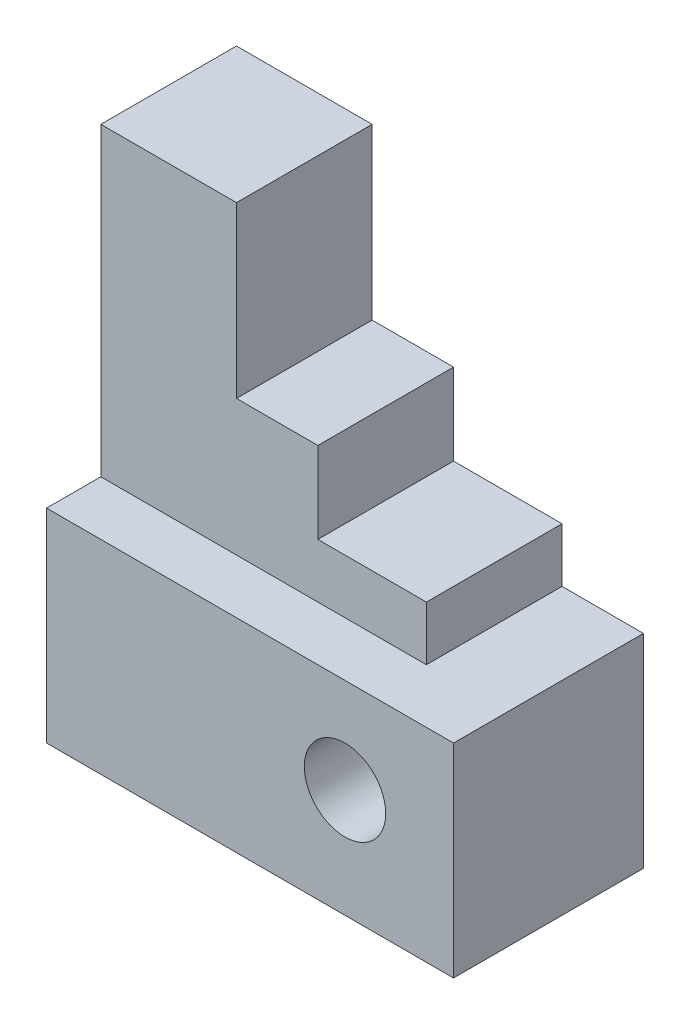
ISO-10303-21;
HEADER;
FILE_DESCRIPTION(('STEP AP214'),'2;1');
FILE_NAME('part.step','',(''),(''),'','','');
FILE_SCHEMA(('AUTOMOTIVE_DESIGN { 1 0 10303 214 1 1 1 1 }'));
ENDSEC;
DATA;
#1=APPLICATION_CONTEXT('core data for automotive mechanical design processes');
#2=APPLICATION_PROTOCOL_DEFINITION('international standard','automotive_design',2000,#1);
#3=PRODUCT_CONTEXT('',#1,'mechanical');
#4=PRODUCT('Part','Part','',(#3));
#5=PRODUCT_RELATED_PRODUCT_CATEGORY('part','',(#4));
#6=PRODUCT_DEFINITION_FORMATION('','',#4);
#7=PRODUCT_DEFINITION_CONTEXT('part definition',#1,'design');
#8=PRODUCT_DEFINITION('design','',#6,#7);
#9=PRODUCT_DEFINITION_SHAPE('','',#8);
#10=(LENGTH_UNIT() NAMED_UNIT(*) SI_UNIT(.MILLI.,.METRE.));
#11=(NAMED_UNIT(*) PLANE_ANGLE_UNIT() SI_UNIT($,.RADIAN.));
#12=(NAMED_UNIT(*) SI_UNIT($,.STERADIAN.) SOLID_ANGLE_UNIT());
#13=UNCERTAINTY_MEASURE_WITH_UNIT(LENGTH_MEASURE(1.E-05),#10,'distance_accuracy_value','');
#14=(GEOMETRIC_REPRESENTATION_CONTEXT(3) GLOBAL_UNCERTAINTY_ASSIGNED_CONTEXT((#13)) GLOBAL_UNIT_ASSIGNED_CONTEXT((#10,
#11,#12)) REPRESENTATION_CONTEXT('',''));
#15=CARTESIAN_POINT('',(0.,0.,0.));
#16=DIRECTION('',(0.,0.,1.));
#17=DIRECTION('',(1.,0.,0.));
#18=AXIS2_PLACEMENT_3D('',#15,#16,#17);
#19=CARTESIAN_POINT('',(0.,30.,28.));
#20=DIRECTION('',(0.,-1.,0.));
#21=DIRECTION('',(0.,0.,-1.));
#22=AXIS2_PLACEMENT_3D('',#19,#20,#21);
#23=PLANE('',#22);
#24=DIRECTION('',(0.,0.,-1.));
#25=VECTOR('',#24,1.);
#26=CARTESIAN_POINT('',(48.,30.,20.));
#27=LINE('',#26,#25);
#28=CARTESIAN_POINT('',(48.,30.,20.));
#29=VERTEX_POINT('',#28);
#30=CARTESIAN_POINT('',(48.,30.,0.));
#31=VERTEX_POINT('',#30);
#32=EDGE_CURVE('E126',#29,#31,#27,.T.);
#33=ORIENTED_EDGE('',*,*,#32,.F.);
#34=DIRECTION('',(1.,0.,0.));
#35=VECTOR('',#34,1.);
#36=CARTESIAN_POINT('',(48.,30.,20.));
#37=LINE('',#36,#35);
#38=CARTESIAN_POINT('',(0.,30.,20.));
#39=VERTEX_POINT('',#38);
#40=EDGE_CURVE('E59',#39,#29,#37,.T.);
#41=ORIENTED_EDGE('',*,*,#40,.F.);
#42=DIRECTION('',(0.,0.,-1.));
#43=VECTOR('',#42,1.);
#44=CARTESIAN_POINT('',(0.,30.,28.));
#45=LINE('',#44,#43);
#46=CARTESIAN_POINT('',(0.,30.,28.));
#47=VERTEX_POINT('',#46);
#48=EDGE_CURVE('E227',#47,#39,#45,.T.);
#49=ORIENTED_EDGE('',*,*,#48,.F.);
#50=DIRECTION('',(-1.,0.,0.));
#51=VECTOR('',#50,1.);
#52=CARTESIAN_POINT('',(0.,30.,28.));
#53=LINE('',#52,#51);
#54=CARTESIAN_POINT('',(60.,30.,28.));
#55=VERTEX_POINT('',#54);
#56=EDGE_CURVE('E224',#55,#47,#53,.T.);
#57=ORIENTED_EDGE('',*,*,#56,.F.);
#58=DIRECTION('',(0.,0.,-1.));
#59=VECTOR('',#58,1.);
#60=CARTESIAN_POINT('',(60.,30.,28.));
#61=LINE('',#60,#59);
#62=CARTESIAN_POINT('',(60.,30.,0.));
#63=VERTEX_POINT('',#62);
#64=EDGE_CURVE('E241',#55,#63,#61,.T.);
#65=ORIENTED_EDGE('',*,*,#64,.T.);
#66=DIRECTION('',(-1.,0.,0.));
#67=VECTOR('',#66,1.);
#68=CARTESIAN_POINT('',(0.,30.,0.));
#69=LINE('',#68,#67);
#70=EDGE_CURVE('E65',#63,#31,#69,.T.);
#71=ORIENTED_EDGE('',*,*,#70,.T.);
#72=EDGE_LOOP('',(#33,#41,#49,#57,#65,#71));
#73=FACE_BOUND('',#72,.T.);
#74=ADVANCED_FACE('F43',(#73),#23,.F.);
#75=CARTESIAN_POINT('',(0.,0.,28.));
#76=DIRECTION('',(0.,0.,-1.));
#77=DIRECTION('',(-1.,0.,0.));
#78=AXIS2_PLACEMENT_3D('',#75,#76,#77);
#79=PLANE('',#78);
#80=DIRECTION('',(0.,-1.,0.));
#81=VECTOR('',#80,1.);
#82=CARTESIAN_POINT('',(0.,0.,28.));
#83=LINE('',#82,#81);
#84=CARTESIAN_POINT('',(0.,0.,28.));
#85=VERTEX_POINT('',#84);
#86=EDGE_CURVE('E214',#47,#85,#83,.T.);
#87=ORIENTED_EDGE('',*,*,#86,.T.);
#88=DIRECTION('',(1.,0.,0.));
#89=VECTOR('',#88,1.);
#90=CARTESIAN_POINT('',(0.,0.,28.));
#91=LINE('',#90,#89);
#92=CARTESIAN_POINT('',(60.,0.,28.));
#93=VERTEX_POINT('',#92);
#94=EDGE_CURVE('E218',#85,#93,#91,.T.);
#95=ORIENTED_EDGE('',*,*,#94,.T.);
#96=DIRECTION('',(0.,1.,0.));
#97=VECTOR('',#96,1.);
#98=CARTESIAN_POINT('',(60.,0.,28.));
#99=LINE('',#98,#97);
#100=EDGE_CURVE('E221',#93,#55,#99,.T.);
#101=ORIENTED_EDGE('',*,*,#100,.T.);
#102=ORIENTED_EDGE('',*,*,#56,.T.);
#103=EDGE_LOOP('',(#87,#95,#101,#102));
#104=FACE_BOUND('',#103,.T.);
#105=CARTESIAN_POINT('',(44.,16.,28.));
#106=DIRECTION('',(0.,0.,1.));
#107=DIRECTION('',(1.,0.,0.));
#108=AXIS2_PLACEMENT_3D('',#105,#106,#107);
#109=CIRCLE('',#108,6.);
#110=CARTESIAN_POINT('',(50.,16.,28.));
#111=VERTEX_POINT('',#110);
#112=EDGE_CURVE('E206',#111,#111,#109,.T.);
#113=ORIENTED_EDGE('',*,*,#112,.F.);
#114=EDGE_LOOP('',(#113));
#115=FACE_BOUND('',#114,.T.);
#116=ADVANCED_FACE('F284',(#104,#115),#79,.F.);
#117=CARTESIAN_POINT('',(0.,0.,0.));
#118=DIRECTION('',(0.,0.,-1.));
#119=DIRECTION('',(-1.,0.,0.));
#120=AXIS2_PLACEMENT_3D('',#117,#118,#119);
#121=PLANE('',#120);
#122=DIRECTION('',(0.,-1.,0.));
#123=VECTOR('',#122,1.);
#124=CARTESIAN_POINT('',(0.,0.,0.));
#125=LINE('',#124,#123);
#126=CARTESIAN_POINT('',(0.,75.,0.));
#127=VERTEX_POINT('',#126);
#128=CARTESIAN_POINT('',(0.,0.,0.));
#129=VERTEX_POINT('',#128);
#130=EDGE_CURVE('E210',#127,#129,#125,.T.);
#131=ORIENTED_EDGE('',*,*,#130,.F.);
#132=DIRECTION('',(-1.,0.,0.));
#133=VECTOR('',#132,1.);
#134=CARTESIAN_POINT('',(0.,75.,0.));
#135=LINE('',#134,#133);
#136=CARTESIAN_POINT('',(20.,75.,0.));
#137=VERTEX_POINT('',#136);
#138=EDGE_CURVE('E147',#137,#127,#135,.T.);
#139=ORIENTED_EDGE('',*,*,#138,.F.);
#140=DIRECTION('',(0.,1.,0.));
#141=VECTOR('',#140,1.);
#142=CARTESIAN_POINT('',(20.,75.,0.));
#143=LINE('',#142,#141);
#144=CARTESIAN_POINT('',(20.,50.,0.));
#145=VERTEX_POINT('',#144);
#146=EDGE_CURVE('E151',#145,#137,#143,.T.);
#147=ORIENTED_EDGE('',*,*,#146,.F.);
#148=DIRECTION('',(-1.,0.,0.));
#149=VECTOR('',#148,1.);
#150=CARTESIAN_POINT('',(20.,50.,0.));
#151=LINE('',#150,#149);
#152=CARTESIAN_POINT('',(32.,50.,0.));
#153=VERTEX_POINT('',#152);
#154=EDGE_CURVE('E180',#153,#145,#151,.T.);
#155=ORIENTED_EDGE('',*,*,#154,.F.);
#156=DIRECTION('',(0.,1.,0.));
#157=VECTOR('',#156,1.);
#158=CARTESIAN_POINT('',(32.,50.,0.));
#159=LINE('',#158,#157);
#160=CARTESIAN_POINT('',(32.,38.,0.));
#161=VERTEX_POINT('',#160);
#162=EDGE_CURVE('E177',#161,#153,#159,.T.);
#163=ORIENTED_EDGE('',*,*,#162,.F.);
#164=DIRECTION('',(-1.,0.,0.));
#165=VECTOR('',#164,1.);
#166=CARTESIAN_POINT('',(32.,38.,0.));
#167=LINE('',#166,#165);
#168=CARTESIAN_POINT('',(48.,38.,0.));
#169=VERTEX_POINT('',#168);
#170=EDGE_CURVE('E174',#169,#161,#167,.T.);
#171=ORIENTED_EDGE('',*,*,#170,.F.);
#172=DIRECTION('',(0.,1.,0.));
#173=VECTOR('',#172,1.);
#174=CARTESIAN_POINT('',(48.,38.,0.));
#175=LINE('',#174,#173);
#176=EDGE_CURVE('E171',#31,#169,#175,.T.);
#177=ORIENTED_EDGE('',*,*,#176,.F.);
#178=ORIENTED_EDGE('',*,*,#70,.F.);
#179=DIRECTION('',(0.,1.,0.));
#180=VECTOR('',#179,1.);
#181=CARTESIAN_POINT('',(60.,0.,0.));
#182=LINE('',#181,#180);
#183=CARTESIAN_POINT('',(60.,0.,0.));
#184=VERTEX_POINT('',#183);
#185=EDGE_CURVE('E234',#184,#63,#182,.T.);
#186=ORIENTED_EDGE('',*,*,#185,.F.);
#187=DIRECTION('',(1.,0.,0.));
#188=VECTOR('',#187,1.);
#189=CARTESIAN_POINT('',(0.,0.,0.));
#190=LINE('',#189,#188);
#191=EDGE_CURVE('E231',#129,#184,#190,.T.);
#192=ORIENTED_EDGE('',*,*,#191,.F.);
#193=EDGE_LOOP('',(#131,#139,#147,#155,#163,#171,#177,#178,#186,#192));
#194=FACE_BOUND('',#193,.T.);
#195=CARTESIAN_POINT('',(44.,16.,0.));
#196=DIRECTION('',(0.,0.,1.));
#197=DIRECTION('',(1.,0.,0.));
#198=AXIS2_PLACEMENT_3D('',#195,#196,#197);
#199=CIRCLE('',#198,6.);
#200=CARTESIAN_POINT('',(50.,16.,0.));
#201=VERTEX_POINT('',#200);
#202=EDGE_CURVE('E130',#201,#201,#199,.T.);
#203=ORIENTED_EDGE('',*,*,#202,.T.);
#204=EDGE_LOOP('',(#203));
#205=FACE_BOUND('',#204,.T.);
#206=ADVANCED_FACE('F253',(#194,#205),#121,.T.);
#207=CARTESIAN_POINT('',(0.,0.,28.));
#208=DIRECTION('',(1.,0.,0.));
#209=DIRECTION('',(0.,0.,-1.));
#210=AXIS2_PLACEMENT_3D('',#207,#208,#209);
#211=PLANE('',#210);
#212=ORIENTED_EDGE('',*,*,#130,.T.);
#213=DIRECTION('',(0.,0.,-1.));
#214=VECTOR('',#213,1.);
#215=CARTESIAN_POINT('',(0.,0.,28.));
#216=LINE('',#215,#214);
#217=EDGE_CURVE('E11',#85,#129,#216,.T.);
#218=ORIENTED_EDGE('',*,*,#217,.F.);
#219=ORIENTED_EDGE('',*,*,#86,.F.);
#220=ORIENTED_EDGE('',*,*,#48,.T.);
#221=DIRECTION('',(0.,-1.,0.));
#222=VECTOR('',#221,1.);
#223=CARTESIAN_POINT('',(0.,30.,20.));
#224=LINE('',#223,#222);
#225=CARTESIAN_POINT('',(0.,75.,20.));
#226=VERTEX_POINT('',#225);
#227=EDGE_CURVE('E145',#226,#39,#224,.T.);
#228=ORIENTED_EDGE('',*,*,#227,.F.);
#229=DIRECTION('',(0.,0.,-1.));
#230=VECTOR('',#229,1.);
#231=CARTESIAN_POINT('',(0.,75.,20.));
#232=LINE('',#231,#230);
#233=EDGE_CURVE('E170',#226,#127,#232,.T.);
#234=ORIENTED_EDGE('',*,*,#233,.T.);
#235=EDGE_LOOP('',(#212,#218,#219,#220,#228,#234));
#236=FACE_BOUND('',#235,.T.);
#237=ADVANCED_FACE('F45',(#236),#211,.F.);
#238=CARTESIAN_POINT('',(0.,0.,28.));
#239=DIRECTION('',(0.,1.,0.));
#240=DIRECTION('',(0.,0.,1.));
#241=AXIS2_PLACEMENT_3D('',#238,#239,#240);
#242=PLANE('',#241);
#243=ORIENTED_EDGE('',*,*,#191,.T.);
#244=DIRECTION('',(0.,0.,-1.));
#245=VECTOR('',#244,1.);
#246=CARTESIAN_POINT('',(60.,0.,28.));
#247=LINE('',#246,#245);
#248=EDGE_CURVE('E52',#93,#184,#247,.T.);
#249=ORIENTED_EDGE('',*,*,#248,.F.);
#250=ORIENTED_EDGE('',*,*,#94,.F.);
#251=ORIENTED_EDGE('',*,*,#217,.T.);
#252=EDGE_LOOP('',(#243,#249,#250,#251));
#253=FACE_BOUND('',#252,.T.);
#254=ADVANCED_FACE('F286',(#253),#242,.F.);
#255=CARTESIAN_POINT('',(60.,0.,28.));
#256=DIRECTION('',(-1.,0.,0.));
#257=DIRECTION('',(0.,0.,1.));
#258=AXIS2_PLACEMENT_3D('',#255,#256,#257);
#259=PLANE('',#258);
#260=ORIENTED_EDGE('',*,*,#185,.T.);
#261=ORIENTED_EDGE('',*,*,#64,.F.);
#262=ORIENTED_EDGE('',*,*,#100,.F.);
#263=ORIENTED_EDGE('',*,*,#248,.T.);
#264=EDGE_LOOP('',(#260,#261,#262,#263));
#265=FACE_BOUND('',#264,.T.);
#266=ADVANCED_FACE('F249',(#265),#259,.F.);
#267=CARTESIAN_POINT('',(44.,16.,28.));
#268=DIRECTION('',(0.,0.,-1.));
#269=DIRECTION('',(-1.,0.,0.));
#270=AXIS2_PLACEMENT_3D('',#267,#268,#269);
#271=CYLINDRICAL_SURFACE('',#270,6.);
#272=ORIENTED_EDGE('',*,*,#112,.T.);
#273=EDGE_LOOP('',(#272));
#274=FACE_BOUND('',#273,.T.);
#275=ORIENTED_EDGE('',*,*,#202,.F.);
#276=EDGE_LOOP('',(#275));
#277=FACE_BOUND('',#276,.T.);
#278=ADVANCED_FACE('F292',(#274,#277),#271,.F.);
#279=CARTESIAN_POINT('',(48.,38.,20.));
#280=DIRECTION('',(-1.,0.,0.));
#281=DIRECTION('',(0.,0.,1.));
#282=AXIS2_PLACEMENT_3D('',#279,#280,#281);
#283=PLANE('',#282);
#284=ORIENTED_EDGE('',*,*,#176,.T.);
#285=DIRECTION('',(0.,0.,-1.));
#286=VECTOR('',#285,1.);
#287=CARTESIAN_POINT('',(48.,38.,20.));
#288=LINE('',#287,#286);
#289=CARTESIAN_POINT('',(48.,38.,20.));
#290=VERTEX_POINT('',#289);
#291=EDGE_CURVE('E131',#290,#169,#288,.T.);
#292=ORIENTED_EDGE('',*,*,#291,.F.);
#293=DIRECTION('',(0.,1.,0.));
#294=VECTOR('',#293,1.);
#295=CARTESIAN_POINT('',(48.,38.,20.));
#296=LINE('',#295,#294);
#297=EDGE_CURVE('E134',#29,#290,#296,.T.);
#298=ORIENTED_EDGE('',*,*,#297,.F.);
#299=ORIENTED_EDGE('',*,*,#32,.T.);
#300=EDGE_LOOP('',(#284,#292,#298,#299));
#301=FACE_BOUND('',#300,.T.);
#302=ADVANCED_FACE('F135',(#301),#283,.F.);
#303=CARTESIAN_POINT('',(32.,38.,20.));
#304=DIRECTION('',(0.,-1.,0.));
#305=DIRECTION('',(0.,0.,-1.));
#306=AXIS2_PLACEMENT_3D('',#303,#304,#305);
#307=PLANE('',#306);
#308=ORIENTED_EDGE('',*,*,#170,.T.);
#309=DIRECTION('',(0.,0.,-1.));
#310=VECTOR('',#309,1.);
#311=CARTESIAN_POINT('',(32.,38.,20.));
#312=LINE('',#311,#310);
#313=CARTESIAN_POINT('',(32.,38.,20.));
#314=VERTEX_POINT('',#313);
#315=EDGE_CURVE('E200',#314,#161,#312,.T.);
#316=ORIENTED_EDGE('',*,*,#315,.F.);
#317=DIRECTION('',(-1.,0.,0.));
#318=VECTOR('',#317,1.);
#319=CARTESIAN_POINT('',(32.,38.,20.));
#320=LINE('',#319,#318);
#321=EDGE_CURVE('E140',#290,#314,#320,.T.);
#322=ORIENTED_EDGE('',*,*,#321,.F.);
#323=ORIENTED_EDGE('',*,*,#291,.T.);
#324=EDGE_LOOP('',(#308,#316,#322,#323));
#325=FACE_BOUND('',#324,.T.);
#326=ADVANCED_FACE('F258',(#325),#307,.F.);
#327=CARTESIAN_POINT('',(32.,50.,20.));
#328=DIRECTION('',(-1.,0.,0.));
#329=DIRECTION('',(0.,0.,1.));
#330=AXIS2_PLACEMENT_3D('',#327,#328,#329);
#331=PLANE('',#330);
#332=ORIENTED_EDGE('',*,*,#162,.T.);
#333=DIRECTION('',(0.,0.,-1.));
#334=VECTOR('',#333,1.);
#335=CARTESIAN_POINT('',(32.,50.,20.));
#336=LINE('',#335,#334);
#337=CARTESIAN_POINT('',(32.,50.,20.));
#338=VERTEX_POINT('',#337);
#339=EDGE_CURVE('E196',#338,#153,#336,.T.);
#340=ORIENTED_EDGE('',*,*,#339,.F.);
#341=DIRECTION('',(0.,1.,0.));
#342=VECTOR('',#341,1.);
#343=CARTESIAN_POINT('',(32.,50.,20.));
#344=LINE('',#343,#342);
#345=EDGE_CURVE('E156',#314,#338,#344,.T.);
#346=ORIENTED_EDGE('',*,*,#345,.F.);
#347=ORIENTED_EDGE('',*,*,#315,.T.);
#348=EDGE_LOOP('',(#332,#340,#346,#347));
#349=FACE_BOUND('',#348,.T.);
#350=ADVANCED_FACE('F265',(#349),#331,.F.);
#351=CARTESIAN_POINT('',(20.,50.,20.));
#352=DIRECTION('',(0.,-1.,0.));
#353=DIRECTION('',(1.,0.,0.));
#354=AXIS2_PLACEMENT_3D('',#351,#352,#353);
#355=PLANE('',#354);
#356=ORIENTED_EDGE('',*,*,#154,.T.);
#357=DIRECTION('',(0.,0.,-1.));
#358=VECTOR('',#357,1.);
#359=CARTESIAN_POINT('',(20.,50.,20.));
#360=LINE('',#359,#358);
#361=CARTESIAN_POINT('',(20.,50.,20.));
#362=VERTEX_POINT('',#361);
#363=EDGE_CURVE('E192',#362,#145,#360,.T.);
#364=ORIENTED_EDGE('',*,*,#363,.F.);
#365=DIRECTION('',(-1.,0.,0.));
#366=VECTOR('',#365,1.);
#367=CARTESIAN_POINT('',(20.,50.,20.));
#368=LINE('',#367,#366);
#369=EDGE_CURVE('E159',#338,#362,#368,.T.);
#370=ORIENTED_EDGE('',*,*,#369,.F.);
#371=ORIENTED_EDGE('',*,*,#339,.T.);
#372=EDGE_LOOP('',(#356,#364,#370,#371));
#373=FACE_BOUND('',#372,.T.);
#374=ADVANCED_FACE('F268',(#373),#355,.F.);
#375=CARTESIAN_POINT('',(20.,75.,20.));
#376=DIRECTION('',(-1.,0.,0.));
#377=DIRECTION('',(0.,-1.,0.));
#378=AXIS2_PLACEMENT_3D('',#375,#376,#377);
#379=PLANE('',#378);
#380=ORIENTED_EDGE('',*,*,#146,.T.);
#381=DIRECTION('',(0.,0.,-1.));
#382=VECTOR('',#381,1.);
#383=CARTESIAN_POINT('',(20.,75.,20.));
#384=LINE('',#383,#382);
#385=CARTESIAN_POINT('',(20.,75.,20.));
#386=VERTEX_POINT('',#385);
#387=EDGE_CURVE('E188',#386,#137,#384,.T.);
#388=ORIENTED_EDGE('',*,*,#387,.F.);
#389=DIRECTION('',(0.,1.,0.));
#390=VECTOR('',#389,1.);
#391=CARTESIAN_POINT('',(20.,75.,20.));
#392=LINE('',#391,#390);
#393=EDGE_CURVE('E162',#362,#386,#392,.T.);
#394=ORIENTED_EDGE('',*,*,#393,.F.);
#395=ORIENTED_EDGE('',*,*,#363,.T.);
#396=EDGE_LOOP('',(#380,#388,#394,#395));
#397=FACE_BOUND('',#396,.T.);
#398=ADVANCED_FACE('F273',(#397),#379,.F.);
#399=CARTESIAN_POINT('',(0.,75.,20.));
#400=DIRECTION('',(0.,-1.,0.));
#401=DIRECTION('',(0.,0.,-1.));
#402=AXIS2_PLACEMENT_3D('',#399,#400,#401);
#403=PLANE('',#402);
#404=ORIENTED_EDGE('',*,*,#138,.T.);
#405=ORIENTED_EDGE('',*,*,#233,.F.);
#406=DIRECTION('',(-1.,0.,0.));
#407=VECTOR('',#406,1.);
#408=CARTESIAN_POINT('',(0.,75.,20.));
#409=LINE('',#408,#407);
#410=EDGE_CURVE('E165',#386,#226,#409,.T.);
#411=ORIENTED_EDGE('',*,*,#410,.F.);
#412=ORIENTED_EDGE('',*,*,#387,.T.);
#413=EDGE_LOOP('',(#404,#405,#411,#412));
#414=FACE_BOUND('',#413,.T.);
#415=ADVANCED_FACE('F277',(#414),#403,.F.);
#416=CARTESIAN_POINT('',(0.,0.,20.));
#417=DIRECTION('',(0.,0.,-1.));
#418=DIRECTION('',(-1.,0.,0.));
#419=AXIS2_PLACEMENT_3D('',#416,#417,#418);
#420=PLANE('',#419);
#421=ORIENTED_EDGE('',*,*,#40,.T.);
#422=ORIENTED_EDGE('',*,*,#297,.T.);
#423=ORIENTED_EDGE('',*,*,#321,.T.);
#424=ORIENTED_EDGE('',*,*,#345,.T.);
#425=ORIENTED_EDGE('',*,*,#369,.T.);
#426=ORIENTED_EDGE('',*,*,#393,.T.);
#427=ORIENTED_EDGE('',*,*,#410,.T.);
#428=ORIENTED_EDGE('',*,*,#227,.T.);
#429=EDGE_LOOP('',(#421,#422,#423,#424,#425,#426,#427,#428));
#430=FACE_BOUND('',#429,.T.);
#431=ADVANCED_FACE('F143',(#430),#420,.F.);
#432=CLOSED_SHELL('',(#74,#116,#206,#237,#254,#266,#278,#302,#326,#350,#374,#398,#415,#431));
#433=MANIFOLD_SOLID_BREP('B2',#432);
#434=ADVANCED_BREP_SHAPE_REPRESENTATION('',(#18,#433),#14);
#435=SHAPE_DEFINITION_REPRESENTATION(#9,#434);
ENDSEC;
END-ISO-10303-21;
